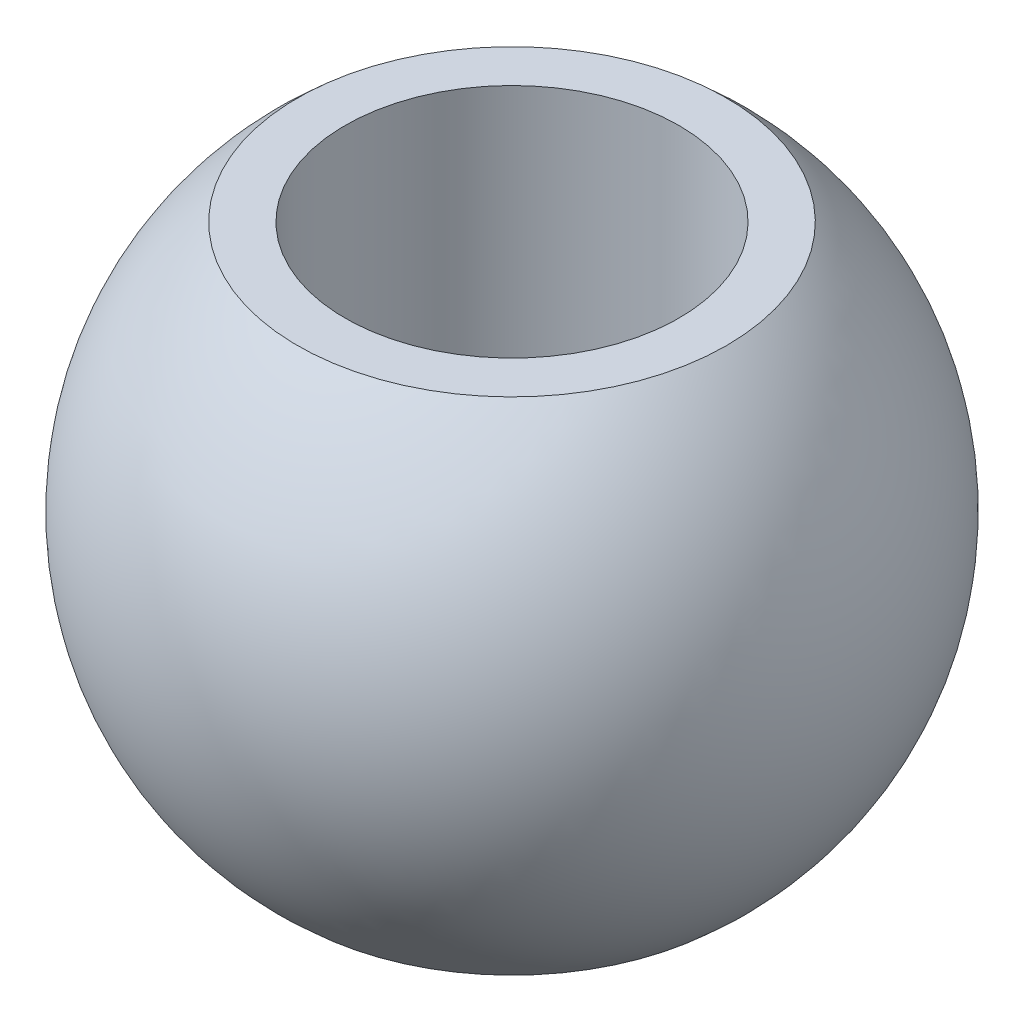
ISO-10303-21;
HEADER;
FILE_DESCRIPTION(('STEP AP214'),'2;1');
FILE_NAME('part.step','',(''),(''),'','','');
FILE_SCHEMA(('AUTOMOTIVE_DESIGN { 1 0 10303 214 1 1 1 1 }'));
ENDSEC;
DATA;
#1=APPLICATION_CONTEXT('core data for automotive mechanical design processes');
#2=APPLICATION_PROTOCOL_DEFINITION('international standard','automotive_design',2000,#1);
#3=PRODUCT_CONTEXT('',#1,'mechanical');
#4=PRODUCT('Part','Part','',(#3));
#5=PRODUCT_RELATED_PRODUCT_CATEGORY('part','',(#4));
#6=PRODUCT_DEFINITION_FORMATION('','',#4);
#7=PRODUCT_DEFINITION_CONTEXT('part definition',#1,'design');
#8=PRODUCT_DEFINITION('design','',#6,#7);
#9=PRODUCT_DEFINITION_SHAPE('','',#8);
#10=(LENGTH_UNIT() NAMED_UNIT(*) SI_UNIT(.MILLI.,.METRE.));
#11=(NAMED_UNIT(*) PLANE_ANGLE_UNIT() SI_UNIT($,.RADIAN.));
#12=(NAMED_UNIT(*) SI_UNIT($,.STERADIAN.) SOLID_ANGLE_UNIT());
#13=UNCERTAINTY_MEASURE_WITH_UNIT(LENGTH_MEASURE(1.E-05),#10,'distance_accuracy_value','');
#14=(GEOMETRIC_REPRESENTATION_CONTEXT(3) GLOBAL_UNCERTAINTY_ASSIGNED_CONTEXT((#13)) GLOBAL_UNIT_ASSIGNED_CONTEXT((#10,
#11,#12)) REPRESENTATION_CONTEXT('',''));
#15=CARTESIAN_POINT('',(0.,0.,0.));
#16=DIRECTION('',(0.,0.,1.));
#17=DIRECTION('',(1.,0.,0.));
#18=AXIS2_PLACEMENT_3D('',#15,#16,#17);
#19=CARTESIAN_POINT('',(0.,0.,0.));
#20=DIRECTION('',(0.,1.,0.));
#21=DIRECTION('',(1.,0.,0.));
#22=AXIS2_PLACEMENT_3D('',#19,#20,#21);
#23=SPHERICAL_SURFACE('',#22,7.9);
#24=CARTESIAN_POINT('',(0.,-6.,0.));
#25=DIRECTION('',(0.,-1.,0.));
#26=DIRECTION('',(0.,0.,-1.));
#27=AXIS2_PLACEMENT_3D('',#24,#25,#26);
#28=CIRCLE('',#27,5.13906606301184);
#29=CARTESIAN_POINT('',(5.13906606301184,-6.,0.));
#30=VERTEX_POINT('',#29);
#31=EDGE_CURVE('E10',#30,#30,#28,.T.);
#32=CARTESIAN_POINT('',(0.,6.,0.));
#33=DIRECTION('',(0.,-1.,0.));
#34=DIRECTION('',(0.,0.,-1.));
#35=AXIS2_PLACEMENT_3D('',#32,#33,#34);
#36=CIRCLE('',#35,5.13906606301184);
#37=CARTESIAN_POINT('',(5.13906606301184,6.,0.));
#38=VERTEX_POINT('',#37);
#39=EDGE_CURVE('E47',#38,#38,#36,.T.);
#40=CARTESIAN_POINT('',(5.13906606301184,-6.,0.));
#41=CARTESIAN_POINT('',(5.24688561650709,-5.90765661555555,0.));
#42=CARTESIAN_POINT('',(5.35221067116129,-5.81240140848863,0.));
#43=CARTESIAN_POINT('',(5.55757787550385,-5.61635678595464,0.));
#44=CARTESIAN_POINT('',(5.65762002519222,-5.51556737048758,0.));
#45=CARTESIAN_POINT('',(5.85212751231939,-5.30874376799812,0.));
#46=CARTESIAN_POINT('',(5.94659284975819,-5.20270958097572,0.));
#47=CARTESIAN_POINT('',(6.12967312079551,-4.98570541883886,0.));
#48=CARTESIAN_POINT('',(6.21828805439405,-4.87473544372441,0.));
#49=CARTESIAN_POINT('',(6.38940982198355,-4.64818187493293,0.));
#50=CARTESIAN_POINT('',(6.47191665597453,-4.5325982812559,0.));
#51=CARTESIAN_POINT('',(6.63058257040973,-4.29715335866014,0.));
#52=CARTESIAN_POINT('',(6.70674165085394,-4.1772920297414,0.));
#53=CARTESIAN_POINT('',(6.85249076797455,-3.93363986568163,0.));
#54=CARTESIAN_POINT('',(6.92208080465094,-3.8098490305406,0.));
#55=CARTESIAN_POINT('',(7.05448965099329,-3.55869752209873,0.));
#56=CARTESIAN_POINT('',(7.11730846065926,-3.43133684879789,0.));
#57=CARTESIAN_POINT('',(7.2359923372613,-3.17341569799846,0.));
#58=CARTESIAN_POINT('',(7.29185740419737,-3.04285522049986,0.));
#59=CARTESIAN_POINT('',(7.39647148462935,-2.77891379361074,0.));
#60=CARTESIAN_POINT('',(7.44522049812525,-2.64553284422022,0.));
#61=CARTESIAN_POINT('',(7.53546083562533,-2.37633800005853,0.));
#62=CARTESIAN_POINT('',(7.57695215962949,-2.24052410528737,0.));
#63=CARTESIAN_POINT('',(7.65255656878145,-1.96685796569869,0.));
#64=CARTESIAN_POINT('',(7.68666965392923,-1.82900572088118,0.));
#65=CARTESIAN_POINT('',(7.74741847279768,-1.55166339874996,0.));
#66=CARTESIAN_POINT('',(7.77405420651834,-1.41217332143625,0.));
#67=CARTESIAN_POINT('',(7.81977093475568,-1.1319606104491,0.));
#68=CARTESIAN_POINT('',(7.83885192927236,-0.991237976775655,0.));
#69=CARTESIAN_POINT('',(7.86940374095221,-0.708969010287226,0.));
#70=CARTESIAN_POINT('',(7.88087455811537,-0.567422677472243,0.));
#71=CARTESIAN_POINT('',(7.89617268763927,-0.283917563104839,0.));
#72=CARTESIAN_POINT('',(7.9,-0.141958781552419,0.));
#73=CARTESIAN_POINT('',(7.9,0.141958781552421,0.));
#74=CARTESIAN_POINT('',(7.89617268763927,0.283917563104841,0.));
#75=CARTESIAN_POINT('',(7.88087455811537,0.567422677472244,0.));
#76=CARTESIAN_POINT('',(7.86940374095221,0.708969010287228,0.));
#77=CARTESIAN_POINT('',(7.83885192927236,0.991237976775657,0.));
#78=CARTESIAN_POINT('',(7.81977093475568,1.1319606104491,0.));
#79=CARTESIAN_POINT('',(7.77405420651834,1.41217332143625,0.));
#80=CARTESIAN_POINT('',(7.74741847279768,1.55166339874996,0.));
#81=CARTESIAN_POINT('',(7.68666965392923,1.82900572088118,0.));
#82=CARTESIAN_POINT('',(7.65255656878145,1.96685796569869,0.));
#83=CARTESIAN_POINT('',(7.57695215962949,2.24052410528737,0.));
#84=CARTESIAN_POINT('',(7.53546083562533,2.37633800005853,0.));
#85=CARTESIAN_POINT('',(7.44522049812525,2.64553284422022,0.));
#86=CARTESIAN_POINT('',(7.39647148462935,2.77891379361074,0.));
#87=CARTESIAN_POINT('',(7.29185740419737,3.04285522049986,0.));
#88=CARTESIAN_POINT('',(7.2359923372613,3.17341569799846,0.));
#89=CARTESIAN_POINT('',(7.11730846065926,3.4313368487979,0.));
#90=CARTESIAN_POINT('',(7.05448965099329,3.55869752209873,0.));
#91=CARTESIAN_POINT('',(6.92208080465094,3.8098490305406,0.));
#92=CARTESIAN_POINT('',(6.85249076797454,3.93363986568163,0.));
#93=CARTESIAN_POINT('',(6.70674165085394,4.1772920297414,0.));
#94=CARTESIAN_POINT('',(6.63058257040973,4.29715335866014,0.));
#95=CARTESIAN_POINT('',(6.47191665597453,4.5325982812559,0.));
#96=CARTESIAN_POINT('',(6.38940982198355,4.64818187493293,0.));
#97=CARTESIAN_POINT('',(6.21828805439404,4.87473544372441,0.));
#98=CARTESIAN_POINT('',(6.12967312079551,4.98570541883886,0.));
#99=CARTESIAN_POINT('',(5.94659284975818,5.20270958097572,0.));
#100=CARTESIAN_POINT('',(5.85212751231939,5.30874376799812,0.));
#101=CARTESIAN_POINT('',(5.65762002519222,5.51556737048758,0.));
#102=CARTESIAN_POINT('',(5.55757787550385,5.61635678595464,0.));
#103=CARTESIAN_POINT('',(5.35221067116129,5.81240140848863,0.));
#104=CARTESIAN_POINT('',(5.24688561650709,5.90765661555555,0.));
#105=CARTESIAN_POINT('',(5.13906606301184,6.,0.));
#106=B_SPLINE_CURVE_WITH_KNOTS('',3,(#40,#41,#42,#43,#44,#45,#46,#47,#48,#49,#50,#51,#52,#53,
#54,#55,#56,#57,#58,#59,#60,#61,#62,#63,#64,#65,#66,#67,#68,#69,#70,#71,#72,#73,#74,#75,#76,#77,
#78,#79,#80,#81,#82,#83,#84,#85,#86,#87,#88,#89,#90,#91,#92,#93,#94,#95,#96,#97,#98,#99,#100,
#101,#102,#103,#104,#105),.UNSPECIFIED.,.F.,.F.,(4,2,2,2,2,2,2,2,2,2,2,2,2,2,2,2,2,2,2,2,2,2,2,
2,2,2,2,2,2,2,2,2,4),(0.,0.425824797937278,0.851649595874557,1.27747439381183,1.70329919174911,
2.12912398968639,2.55494878762367,2.98077358556095,3.40659838349822,3.8324231814355,
4.25824797937278,4.68407277731006,5.10989757524734,5.53572237318462,5.96154717112189,
6.38737196905917,6.81319676699645,7.23902156493373,7.66484636287101,8.09067116080829,
8.51649595874556,8.94232075668284,9.36814555462012,9.7939703525574,10.2197951504947,
10.645619948432,11.0714447463692,11.4972695443065,11.9230943422438,12.3489191401811,
12.7747439381183,13.2005687360556,13.6263935339929),.UNSPECIFIED.);
#107=EDGE_CURVE('BSEAM33',#30,#38,#106,.T.);
#108=ORIENTED_EDGE('',*,*,#31,.F.);
#109=ORIENTED_EDGE('',*,*,#39,.T.);
#110=ORIENTED_EDGE('',*,*,#107,.T.);
#111=ORIENTED_EDGE('',*,*,#107,.F.);
#112=EDGE_LOOP('',(#108,#110,#109,#111));
#113=FACE_BOUND('',#112,.T.);
#114=ADVANCED_FACE('F33',(#113),#23,.T.);
#115=CARTESIAN_POINT('',(5.13906606301184,-6.,0.));
#116=DIRECTION('',(0.,-1.,0.));
#117=DIRECTION('',(0.,0.,1.));
#118=AXIS2_PLACEMENT_3D('',#115,#116,#117);
#119=PLANE('',#118);
#120=CARTESIAN_POINT('',(0.,-6.,0.));
#121=DIRECTION('',(0.,-1.,0.));
#122=DIRECTION('',(0.,0.,-1.));
#123=AXIS2_PLACEMENT_3D('',#120,#121,#122);
#124=CIRCLE('',#123,4.);
#125=CARTESIAN_POINT('',(0.,-6.,-4.));
#126=VERTEX_POINT('',#125);
#127=EDGE_CURVE('E39',#126,#126,#124,.T.);
#128=ORIENTED_EDGE('',*,*,#127,.F.);
#129=EDGE_LOOP('',(#128));
#130=FACE_BOUND('',#129,.T.);
#131=ORIENTED_EDGE('',*,*,#31,.T.);
#132=EDGE_LOOP('',(#131));
#133=FACE_BOUND('',#132,.T.);
#134=ADVANCED_FACE('F62',(#130,#133),#119,.T.);
#135=CARTESIAN_POINT('',(0.,-6.,0.));
#136=DIRECTION('',(0.,1.,0.));
#137=DIRECTION('',(0.,0.,-1.));
#138=AXIS2_PLACEMENT_3D('',#135,#136,#137);
#139=CYLINDRICAL_SURFACE('',#138,4.);
#140=CARTESIAN_POINT('',(0.,6.,0.));
#141=DIRECTION('',(0.,-1.,0.));
#142=DIRECTION('',(0.,0.,-1.));
#143=AXIS2_PLACEMENT_3D('',#140,#141,#142);
#144=CIRCLE('',#143,4.);
#145=CARTESIAN_POINT('',(0.,6.,-4.));
#146=VERTEX_POINT('',#145);
#147=EDGE_CURVE('E43',#146,#146,#144,.T.);
#148=ORIENTED_EDGE('',*,*,#147,.F.);
#149=EDGE_LOOP('',(#148));
#150=FACE_BOUND('',#149,.T.);
#151=ORIENTED_EDGE('',*,*,#127,.T.);
#152=EDGE_LOOP('',(#151));
#153=FACE_BOUND('',#152,.T.);
#154=ADVANCED_FACE('F57',(#150,#153),#139,.F.);
#155=CARTESIAN_POINT('',(4.,6.,0.));
#156=DIRECTION('',(0.,1.,0.));
#157=DIRECTION('',(0.,0.,-1.));
#158=AXIS2_PLACEMENT_3D('',#155,#156,#157);
#159=PLANE('',#158);
#160=ORIENTED_EDGE('',*,*,#39,.F.);
#161=EDGE_LOOP('',(#160));
#162=FACE_BOUND('',#161,.T.);
#163=ORIENTED_EDGE('',*,*,#147,.T.);
#164=EDGE_LOOP('',(#163));
#165=FACE_BOUND('',#164,.T.);
#166=ADVANCED_FACE('F54',(#162,#165),#159,.T.);
#167=CLOSED_SHELL('',(#114,#134,#154,#166));
#168=MANIFOLD_SOLID_BREP('B2',#167);
#169=ADVANCED_BREP_SHAPE_REPRESENTATION('',(#18,#168),#14);
#170=SHAPE_DEFINITION_REPRESENTATION(#9,#169);
ENDSEC;
END-ISO-10303-21;
